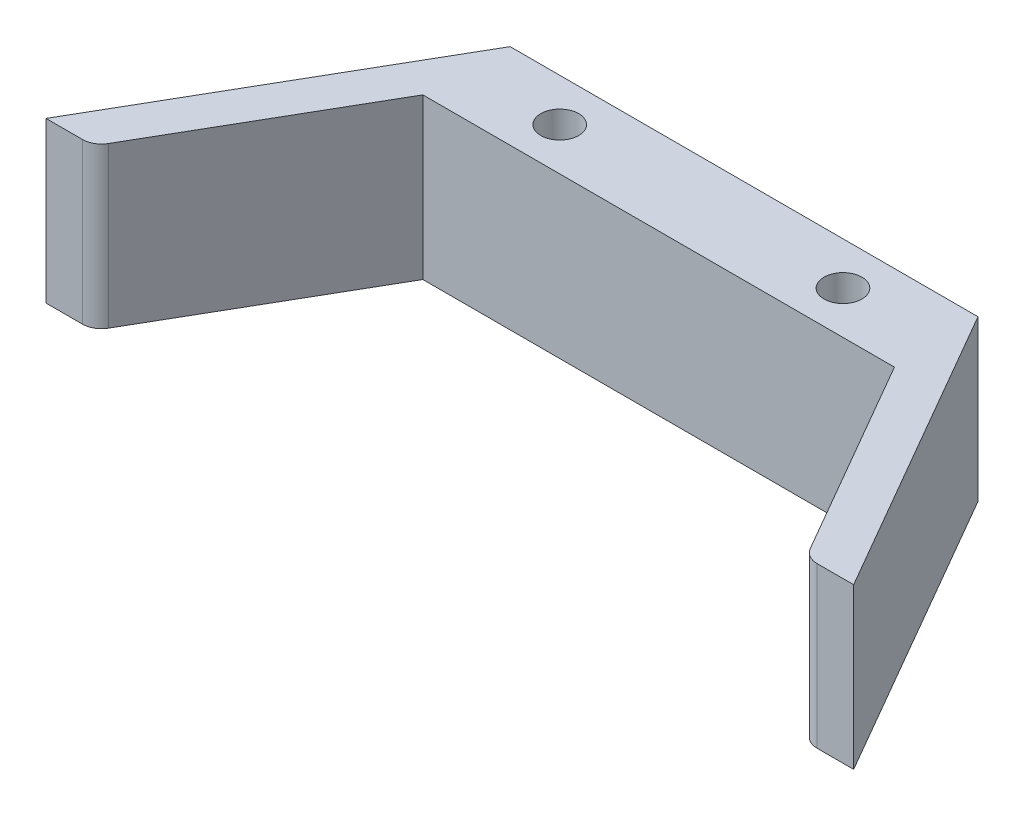
ISO-10303-21;
HEADER;
FILE_DESCRIPTION(('STEP AP214'),'2;1');
FILE_NAME('part.step','',(''),(''),'','','');
FILE_SCHEMA(('AUTOMOTIVE_DESIGN { 1 0 10303 214 1 1 1 1 }'));
ENDSEC;
DATA;
#1=APPLICATION_CONTEXT('core data for automotive mechanical design processes');
#2=APPLICATION_PROTOCOL_DEFINITION('international standard','automotive_design',2000,#1);
#3=PRODUCT_CONTEXT('',#1,'mechanical');
#4=PRODUCT('Part','Part','',(#3));
#5=PRODUCT_RELATED_PRODUCT_CATEGORY('part','',(#4));
#6=PRODUCT_DEFINITION_FORMATION('','',#4);
#7=PRODUCT_DEFINITION_CONTEXT('part definition',#1,'design');
#8=PRODUCT_DEFINITION('design','',#6,#7);
#9=PRODUCT_DEFINITION_SHAPE('','',#8);
#10=(LENGTH_UNIT() NAMED_UNIT(*) SI_UNIT(.MILLI.,.METRE.));
#11=(NAMED_UNIT(*) PLANE_ANGLE_UNIT() SI_UNIT($,.RADIAN.));
#12=(NAMED_UNIT(*) SI_UNIT($,.STERADIAN.) SOLID_ANGLE_UNIT());
#13=UNCERTAINTY_MEASURE_WITH_UNIT(LENGTH_MEASURE(1.E-05),#10,'distance_accuracy_value','');
#14=(GEOMETRIC_REPRESENTATION_CONTEXT(3) GLOBAL_UNCERTAINTY_ASSIGNED_CONTEXT((#13)) GLOBAL_UNIT_ASSIGNED_CONTEXT((#10,
#11,#12)) REPRESENTATION_CONTEXT('',''));
#15=CARTESIAN_POINT('',(0.,0.,0.));
#16=DIRECTION('',(0.,0.,1.));
#17=DIRECTION('',(1.,0.,0.));
#18=AXIS2_PLACEMENT_3D('',#15,#16,#17);
#19=CARTESIAN_POINT('',(0.,16.85,0.));
#20=DIRECTION('',(0.,0.,-1.));
#21=DIRECTION('',(-1.,0.,0.));
#22=AXIS2_PLACEMENT_3D('',#19,#20,#21);
#23=PLANE('',#22);
#24=DIRECTION('',(1.,0.,0.));
#25=VECTOR('',#24,1.);
#26=CARTESIAN_POINT('',(0.,0.,0.));
#27=LINE('',#26,#25);
#28=CARTESIAN_POINT('',(-24.8411524227069,0.,1.05016223731814E-12));
#29=VERTEX_POINT('',#28);
#30=CARTESIAN_POINT('',(24.8411524227069,0.,0.));
#31=VERTEX_POINT('',#30);
#32=EDGE_CURVE('E163',#29,#31,#27,.T.);
#33=ORIENTED_EDGE('',*,*,#32,.T.);
#34=DIRECTION('',(0.,-1.,0.));
#35=VECTOR('',#34,1.);
#36=CARTESIAN_POINT('',(24.8411524227069,16.85,0.));
#37=LINE('',#36,#35);
#38=CARTESIAN_POINT('',(24.8411524227069,16.85,0.));
#39=VERTEX_POINT('',#38);
#40=EDGE_CURVE('E11',#39,#31,#37,.T.);
#41=ORIENTED_EDGE('',*,*,#40,.F.);
#42=DIRECTION('',(1.,0.,0.));
#43=VECTOR('',#42,1.);
#44=CARTESIAN_POINT('',(0.,16.85,0.));
#45=LINE('',#44,#43);
#46=CARTESIAN_POINT('',(-24.8411524227069,16.85,1.05016223731814E-12));
#47=VERTEX_POINT('',#46);
#48=EDGE_CURVE('E102',#47,#39,#45,.T.);
#49=ORIENTED_EDGE('',*,*,#48,.F.);
#50=DIRECTION('',(0.,-1.,0.));
#51=VECTOR('',#50,1.);
#52=CARTESIAN_POINT('',(-24.8411524227069,16.85,1.05016223731814E-12));
#53=LINE('',#52,#51);
#54=EDGE_CURVE('E162',#47,#29,#53,.T.);
#55=ORIENTED_EDGE('',*,*,#54,.T.);
#56=EDGE_LOOP('',(#33,#41,#49,#55));
#57=FACE_BOUND('',#56,.T.);
#58=ADVANCED_FACE('F43',(#57),#23,.F.);
#59=CARTESIAN_POINT('',(18.6308643170516,16.85,-10.7565345286572));
#60=DIRECTION('',(-0.866025403785067,0.,0.499999999998913));
#61=DIRECTION('',(0.499999999998913,0.,0.866025403785067));
#62=AXIS2_PLACEMENT_3D('',#59,#60,#61);
#63=PLANE('',#62);
#64=DIRECTION('',(-0.499999999998913,0.,-0.866025403785067));
#65=VECTOR('',#64,1.);
#66=CARTESIAN_POINT('',(18.6308643170516,0.,-10.7565345286572));
#67=LINE('',#66,#65);
#68=CARTESIAN_POINT('',(36.9655080756526,0.,21.0000000000034));
#69=VERTEX_POINT('',#68);
#70=EDGE_CURVE('E167',#69,#31,#67,.T.);
#71=ORIENTED_EDGE('',*,*,#70,.F.);
#72=DIRECTION('',(0.,-1.,0.));
#73=VECTOR('',#72,1.);
#74=CARTESIAN_POINT('',(36.9655080756526,16.85,21.0000000000034));
#75=LINE('',#74,#73);
#76=CARTESIAN_POINT('',(36.9655080756526,16.85,21.0000000000034));
#77=VERTEX_POINT('',#76);
#78=EDGE_CURVE('E52',#77,#69,#75,.T.);
#79=ORIENTED_EDGE('',*,*,#78,.F.);
#80=DIRECTION('',(-0.499999999998913,0.,-0.866025403785067));
#81=VECTOR('',#80,1.);
#82=CARTESIAN_POINT('',(18.6308643170516,16.85,-10.7565345286572));
#83=LINE('',#82,#81);
#84=EDGE_CURVE('E239',#77,#39,#83,.T.);
#85=ORIENTED_EDGE('',*,*,#84,.T.);
#86=ORIENTED_EDGE('',*,*,#40,.T.);
#87=EDGE_LOOP('',(#71,#79,#85,#86));
#88=FACE_BOUND('',#87,.T.);
#89=ADVANCED_FACE('F238',(#88),#63,.T.);
#90=CARTESIAN_POINT('',(38.6975588832227,16.85,20.0000000000056));
#91=DIRECTION('',(0.,-1.,0.));
#92=DIRECTION('',(0.,0.,-1.));
#93=AXIS2_PLACEMENT_3D('',#90,#91,#92);
#94=CYLINDRICAL_SURFACE('',#93,2.);
#95=CARTESIAN_POINT('',(38.6975588832227,0.,20.0000000000056));
#96=DIRECTION('',(0.,1.,0.));
#97=DIRECTION('',(0.,0.,1.));
#98=AXIS2_PLACEMENT_3D('',#95,#96,#97);
#99=CIRCLE('',#98,2.);
#100=CARTESIAN_POINT('',(38.6975588832227,0.,22.0000000000056));
#101=VERTEX_POINT('',#100);
#102=EDGE_CURVE('E171',#69,#101,#99,.T.);
#103=ORIENTED_EDGE('',*,*,#102,.T.);
#104=DIRECTION('',(0.,-1.,0.));
#105=VECTOR('',#104,1.);
#106=CARTESIAN_POINT('',(38.6975588832227,16.85,22.0000000000056));
#107=LINE('',#106,#105);
#108=CARTESIAN_POINT('',(38.6975588832227,16.85,22.0000000000056));
#109=VERTEX_POINT('',#108);
#110=EDGE_CURVE('E220',#109,#101,#107,.T.);
#111=ORIENTED_EDGE('',*,*,#110,.F.);
#112=CARTESIAN_POINT('',(38.6975588832227,16.85,20.0000000000056));
#113=DIRECTION('',(0.,1.,0.));
#114=DIRECTION('',(0.,0.,1.));
#115=AXIS2_PLACEMENT_3D('',#112,#113,#114);
#116=CIRCLE('',#115,2.);
#117=EDGE_CURVE('E228',#77,#109,#116,.T.);
#118=ORIENTED_EDGE('',*,*,#117,.F.);
#119=ORIENTED_EDGE('',*,*,#78,.T.);
#120=EDGE_LOOP('',(#103,#111,#118,#119));
#121=FACE_BOUND('',#120,.T.);
#122=ADVANCED_FACE('F226',(#121),#94,.T.);
#123=CARTESIAN_POINT('',(-5.55111512312578E-12,16.85,22.));
#124=DIRECTION('',(0.,0.,1.));
#125=DIRECTION('',(1.,0.,0.));
#126=AXIS2_PLACEMENT_3D('',#123,#124,#125);
#127=PLANE('',#126);
#128=DIRECTION('',(-1.,0.,0.));
#129=VECTOR('',#128,1.);
#130=CARTESIAN_POINT('',(-5.55111512312578E-12,0.,22.));
#131=LINE('',#130,#129);
#132=CARTESIAN_POINT('',(42.5428583448418,0.,22.));
#133=VERTEX_POINT('',#132);
#134=EDGE_CURVE('E175',#133,#101,#131,.T.);
#135=ORIENTED_EDGE('',*,*,#134,.F.);
#136=DIRECTION('',(0.,-1.,0.));
#137=VECTOR('',#136,1.);
#138=CARTESIAN_POINT('',(42.5428583448418,16.85,22.));
#139=LINE('',#138,#137);
#140=CARTESIAN_POINT('',(42.5428583448418,16.85,22.));
#141=VERTEX_POINT('',#140);
#142=EDGE_CURVE('E217',#141,#133,#139,.T.);
#143=ORIENTED_EDGE('',*,*,#142,.F.);
#144=DIRECTION('',(-1.,0.,0.));
#145=VECTOR('',#144,1.);
#146=CARTESIAN_POINT('',(-5.55111512312578E-12,16.85,22.));
#147=LINE('',#146,#145);
#148=EDGE_CURVE('E259',#141,#109,#147,.T.);
#149=ORIENTED_EDGE('',*,*,#148,.T.);
#150=ORIENTED_EDGE('',*,*,#110,.T.);
#151=EDGE_LOOP('',(#135,#143,#149,#150));
#152=FACE_BOUND('',#151,.T.);
#153=ADVANCED_FACE('F257',(#152),#127,.T.);
#154=CARTESIAN_POINT('',(22.3808643170272,16.85,-12.9215980381305));
#155=DIRECTION('',(-0.866025403784444,0.,0.499999999999991));
#156=DIRECTION('',(0.499999999999991,0.,0.866025403784444));
#157=AXIS2_PLACEMENT_3D('',#154,#155,#156);
#158=PLANE('',#157);
#159=DIRECTION('',(-0.499999999999991,0.,-0.866025403784444));
#160=VECTOR('',#159,1.);
#161=CARTESIAN_POINT('',(22.3808643170272,0.,-12.9215980381305));
#162=LINE('',#161,#160);
#163=CARTESIAN_POINT('',(24.6449999999972,0.,-8.99999999999679));
#164=VERTEX_POINT('',#163);
#165=EDGE_CURVE('E179',#133,#164,#162,.T.);
#166=ORIENTED_EDGE('',*,*,#165,.T.);
#167=DIRECTION('',(0.,-1.,0.));
#168=VECTOR('',#167,1.);
#169=CARTESIAN_POINT('',(24.6449999999972,16.85,-8.99999999999679));
#170=LINE('',#169,#168);
#171=CARTESIAN_POINT('',(24.6449999999972,16.85,-8.99999999999679));
#172=VERTEX_POINT('',#171);
#173=EDGE_CURVE('E213',#172,#164,#170,.T.);
#174=ORIENTED_EDGE('',*,*,#173,.F.);
#175=DIRECTION('',(-0.499999999999991,0.,-0.866025403784444));
#176=VECTOR('',#175,1.);
#177=CARTESIAN_POINT('',(22.3808643170272,16.85,-12.9215980381305));
#178=LINE('',#177,#176);
#179=EDGE_CURVE('E254',#141,#172,#178,.T.);
#180=ORIENTED_EDGE('',*,*,#179,.F.);
#181=ORIENTED_EDGE('',*,*,#142,.T.);
#182=EDGE_LOOP('',(#166,#174,#180,#181));
#183=FACE_BOUND('',#182,.T.);
#184=ADVANCED_FACE('F253',(#183),#158,.F.);
#185=CARTESIAN_POINT('',(-2.41473507855972E-12,16.85,-8.99999999999986));
#186=DIRECTION('',(0.,0.,1.));
#187=DIRECTION('',(1.,0.,0.));
#188=AXIS2_PLACEMENT_3D('',#185,#186,#187);
#189=PLANE('',#188);
#190=DIRECTION('',(-1.,0.,0.));
#191=VECTOR('',#190,1.);
#192=CARTESIAN_POINT('',(-2.41473507855972E-12,0.,-8.99999999999986));
#193=LINE('',#192,#191);
#194=CARTESIAN_POINT('',(-24.6450000000022,0.,-8.99999999999986));
#195=VERTEX_POINT('',#194);
#196=EDGE_CURVE('E182',#164,#195,#193,.T.);
#197=ORIENTED_EDGE('',*,*,#196,.T.);
#198=DIRECTION('',(0.,-1.,0.));
#199=VECTOR('',#198,1.);
#200=CARTESIAN_POINT('',(-24.6450000000022,16.85,-8.99999999999986));
#201=LINE('',#200,#199);
#202=CARTESIAN_POINT('',(-24.6450000000022,16.85,-8.99999999999986));
#203=VERTEX_POINT('',#202);
#204=EDGE_CURVE('E209',#203,#195,#201,.T.);
#205=ORIENTED_EDGE('',*,*,#204,.F.);
#206=DIRECTION('',(-1.,0.,0.));
#207=VECTOR('',#206,1.);
#208=CARTESIAN_POINT('',(-2.41473507855972E-12,16.85,-8.99999999999986));
#209=LINE('',#208,#207);
#210=EDGE_CURVE('E249',#172,#203,#209,.T.);
#211=ORIENTED_EDGE('',*,*,#210,.F.);
#212=ORIENTED_EDGE('',*,*,#173,.T.);
#213=EDGE_LOOP('',(#197,#205,#211,#212));
#214=FACE_BOUND('',#213,.T.);
#215=ADVANCED_FACE('F248',(#214),#189,.F.);
#216=CARTESIAN_POINT('',(-22.3808643170321,16.85,-12.9215980381337));
#217=DIRECTION('',(0.866025403784436,0.,0.500000000000004));
#218=DIRECTION('',(0.500000000000004,0.,-0.866025403784436));
#219=AXIS2_PLACEMENT_3D('',#216,#217,#218);
#220=PLANE('',#219);
#221=DIRECTION('',(-0.500000000000004,0.,0.866025403784436));
#222=VECTOR('',#221,1.);
#223=CARTESIAN_POINT('',(-22.3808643170321,0.,-12.9215980381337));
#224=LINE('',#223,#222);
#225=CARTESIAN_POINT('',(-42.5428583448418,0.,22.));
#226=VERTEX_POINT('',#225);
#227=EDGE_CURVE('E185',#195,#226,#224,.T.);
#228=ORIENTED_EDGE('',*,*,#227,.T.);
#229=DIRECTION('',(0.,-1.,0.));
#230=VECTOR('',#229,1.);
#231=CARTESIAN_POINT('',(-42.5428583448418,16.85,22.));
#232=LINE('',#231,#230);
#233=CARTESIAN_POINT('',(-42.5428583448418,16.85,22.));
#234=VERTEX_POINT('',#233);
#235=EDGE_CURVE('E145',#234,#226,#232,.T.);
#236=ORIENTED_EDGE('',*,*,#235,.F.);
#237=DIRECTION('',(-0.500000000000004,0.,0.866025403784436));
#238=VECTOR('',#237,1.);
#239=CARTESIAN_POINT('',(-22.3808643170321,16.85,-12.9215980381337));
#240=LINE('',#239,#238);
#241=EDGE_CURVE('E130',#203,#234,#240,.T.);
#242=ORIENTED_EDGE('',*,*,#241,.F.);
#243=ORIENTED_EDGE('',*,*,#204,.T.);
#244=EDGE_LOOP('',(#228,#236,#242,#243));
#245=FACE_BOUND('',#244,.T.);
#246=ADVANCED_FACE('F244',(#245),#220,.F.);
#247=CARTESIAN_POINT('',(-1.84574577843932E-12,16.85,22.));
#248=DIRECTION('',(0.,0.,-1.));
#249=DIRECTION('',(-1.,0.,0.));
#250=AXIS2_PLACEMENT_3D('',#247,#248,#249);
#251=PLANE('',#250);
#252=DIRECTION('',(1.,0.,0.));
#253=VECTOR('',#252,1.);
#254=CARTESIAN_POINT('',(-1.84574577843932E-12,0.,22.));
#255=LINE('',#254,#253);
#256=CARTESIAN_POINT('',(-38.6975588832227,0.,22.));
#257=VERTEX_POINT('',#256);
#258=EDGE_CURVE('E140',#226,#257,#255,.T.);
#259=ORIENTED_EDGE('',*,*,#258,.T.);
#260=DIRECTION('',(0.,-1.,0.));
#261=VECTOR('',#260,1.);
#262=CARTESIAN_POINT('',(-38.6975588832227,16.85,22.));
#263=LINE('',#262,#261);
#264=CARTESIAN_POINT('',(-38.6975588832227,16.85,22.));
#265=VERTEX_POINT('',#264);
#266=EDGE_CURVE('E137',#265,#257,#263,.T.);
#267=ORIENTED_EDGE('',*,*,#266,.F.);
#268=DIRECTION('',(1.,0.,0.));
#269=VECTOR('',#268,1.);
#270=CARTESIAN_POINT('',(-1.84574577843932E-12,16.85,22.));
#271=LINE('',#270,#269);
#272=EDGE_CURVE('E123',#234,#265,#271,.T.);
#273=ORIENTED_EDGE('',*,*,#272,.F.);
#274=ORIENTED_EDGE('',*,*,#235,.T.);
#275=EDGE_LOOP('',(#259,#267,#273,#274));
#276=FACE_BOUND('',#275,.T.);
#277=ADVANCED_FACE('F138',(#276),#251,.F.);
#278=CARTESIAN_POINT('',(-38.6975588832227,16.85,20.));
#279=DIRECTION('',(0.,-1.,0.));
#280=DIRECTION('',(0.,0.,-1.));
#281=AXIS2_PLACEMENT_3D('',#278,#279,#280);
#282=CYLINDRICAL_SURFACE('',#281,2.);
#283=CARTESIAN_POINT('',(-38.6975588832227,0.,20.));
#284=DIRECTION('',(0.,1.,0.));
#285=DIRECTION('',(0.,0.,1.));
#286=AXIS2_PLACEMENT_3D('',#283,#284,#285);
#287=CIRCLE('',#286,2.);
#288=CARTESIAN_POINT('',(-36.9655080756526,0.,20.9999999999978));
#289=VERTEX_POINT('',#288);
#290=EDGE_CURVE('E190',#289,#257,#287,.F.);
#291=ORIENTED_EDGE('',*,*,#290,.F.);
#292=DIRECTION('',(0.,-1.,0.));
#293=VECTOR('',#292,1.);
#294=CARTESIAN_POINT('',(-36.9655080756526,16.85,20.9999999999978));
#295=LINE('',#294,#293);
#296=CARTESIAN_POINT('',(-36.9655080756526,16.85,20.9999999999978));
#297=VERTEX_POINT('',#296);
#298=EDGE_CURVE('E93',#297,#289,#295,.T.);
#299=ORIENTED_EDGE('',*,*,#298,.F.);
#300=CARTESIAN_POINT('',(-38.6975588832227,16.85,20.));
#301=DIRECTION('',(0.,1.,0.));
#302=DIRECTION('',(0.,0.,1.));
#303=AXIS2_PLACEMENT_3D('',#300,#301,#302);
#304=CIRCLE('',#303,2.);
#305=EDGE_CURVE('E128',#297,#265,#304,.F.);
#306=ORIENTED_EDGE('',*,*,#305,.T.);
#307=ORIENTED_EDGE('',*,*,#266,.T.);
#308=EDGE_LOOP('',(#291,#299,#306,#307));
#309=FACE_BOUND('',#308,.T.);
#310=ADVANCED_FACE('F147',(#309),#282,.T.);
#311=CARTESIAN_POINT('',(-14.9200000000024,16.85,-4.49999999999759));
#312=DIRECTION('',(0.,-1.,0.));
#313=DIRECTION('',(0.,0.,-1.));
#314=AXIS2_PLACEMENT_3D('',#311,#312,#313);
#315=CYLINDRICAL_SURFACE('',#314,2.);
#316=CARTESIAN_POINT('',(-14.9200000000024,16.85,-4.49999999999759));
#317=DIRECTION('',(0.,1.,0.));
#318=DIRECTION('',(0.,0.,1.));
#319=AXIS2_PLACEMENT_3D('',#316,#317,#318);
#320=CIRCLE('',#319,2.);
#321=CARTESIAN_POINT('',(-14.9200000000024,16.85,-2.49999999999759));
#322=VERTEX_POINT('',#321);
#323=EDGE_CURVE('E151',#322,#322,#320,.T.);
#324=ORIENTED_EDGE('',*,*,#323,.T.);
#325=EDGE_LOOP('',(#324));
#326=FACE_BOUND('',#325,.T.);
#327=CARTESIAN_POINT('',(-14.9200000000024,0.,-4.49999999999759));
#328=DIRECTION('',(0.,1.,0.));
#329=DIRECTION('',(0.,0.,1.));
#330=AXIS2_PLACEMENT_3D('',#327,#328,#329);
#331=CIRCLE('',#330,2.);
#332=CARTESIAN_POINT('',(-14.9200000000024,0.,-2.49999999999759));
#333=VERTEX_POINT('',#332);
#334=EDGE_CURVE('E195',#333,#333,#331,.T.);
#335=ORIENTED_EDGE('',*,*,#334,.F.);
#336=EDGE_LOOP('',(#335));
#337=FACE_BOUND('',#336,.T.);
#338=ADVANCED_FACE('F341',(#326,#337),#315,.F.);
#339=CARTESIAN_POINT('',(-18.6308643170589,16.85,-10.7565345286553));
#340=DIRECTION('',(-0.866025403785066,0.,-0.499999999998914));
#341=DIRECTION('',(-0.499999999998914,0.,0.866025403785066));
#342=AXIS2_PLACEMENT_3D('',#339,#340,#341);
#343=PLANE('',#342);
#344=DIRECTION('',(0.499999999998914,0.,-0.866025403785066));
#345=VECTOR('',#344,1.);
#346=CARTESIAN_POINT('',(-18.6308643170589,0.,-10.7565345286553));
#347=LINE('',#346,#345);
#348=EDGE_CURVE('E96',#289,#29,#347,.T.);
#349=ORIENTED_EDGE('',*,*,#348,.T.);
#350=ORIENTED_EDGE('',*,*,#54,.F.);
#351=DIRECTION('',(0.499999999998914,0.,-0.866025403785066));
#352=VECTOR('',#351,1.);
#353=CARTESIAN_POINT('',(-18.6308643170589,16.85,-10.7565345286553));
#354=LINE('',#353,#352);
#355=EDGE_CURVE('E60',#297,#47,#354,.T.);
#356=ORIENTED_EDGE('',*,*,#355,.F.);
#357=ORIENTED_EDGE('',*,*,#298,.T.);
#358=EDGE_LOOP('',(#349,#350,#356,#357));
#359=FACE_BOUND('',#358,.T.);
#360=ADVANCED_FACE('F351',(#359),#343,.F.);
#361=CARTESIAN_POINT('',(14.9199999999969,16.85,-4.5));
#362=DIRECTION('',(0.,-1.,0.));
#363=DIRECTION('',(0.,0.,-1.));
#364=AXIS2_PLACEMENT_3D('',#361,#362,#363);
#365=CYLINDRICAL_SURFACE('',#364,2.);
#366=CARTESIAN_POINT('',(14.9199999999969,16.85,-4.5));
#367=DIRECTION('',(0.,1.,0.));
#368=DIRECTION('',(0.,0.,1.));
#369=AXIS2_PLACEMENT_3D('',#366,#367,#368);
#370=CIRCLE('',#369,2.);
#371=CARTESIAN_POINT('',(14.9199999999969,16.85,-2.5));
#372=VERTEX_POINT('',#371);
#373=EDGE_CURVE('E158',#372,#372,#370,.F.);
#374=ORIENTED_EDGE('',*,*,#373,.F.);
#375=EDGE_LOOP('',(#374));
#376=FACE_BOUND('',#375,.T.);
#377=CARTESIAN_POINT('',(14.9199999999969,0.,-4.5));
#378=DIRECTION('',(0.,1.,0.));
#379=DIRECTION('',(0.,0.,1.));
#380=AXIS2_PLACEMENT_3D('',#377,#378,#379);
#381=CIRCLE('',#380,2.);
#382=CARTESIAN_POINT('',(14.9199999999969,0.,-2.5));
#383=VERTEX_POINT('',#382);
#384=EDGE_CURVE('E199',#383,#383,#381,.F.);
#385=ORIENTED_EDGE('',*,*,#384,.T.);
#386=EDGE_LOOP('',(#385));
#387=FACE_BOUND('',#386,.T.);
#388=ADVANCED_FACE('F362',(#376,#387),#365,.F.);
#389=CARTESIAN_POINT('',(0.,16.85,0.));
#390=DIRECTION('',(0.,1.,0.));
#391=DIRECTION('',(0.,0.,1.));
#392=AXIS2_PLACEMENT_3D('',#389,#390,#391);
#393=PLANE('',#392);
#394=ORIENTED_EDGE('',*,*,#48,.T.);
#395=ORIENTED_EDGE('',*,*,#84,.F.);
#396=ORIENTED_EDGE('',*,*,#117,.T.);
#397=ORIENTED_EDGE('',*,*,#148,.F.);
#398=ORIENTED_EDGE('',*,*,#179,.T.);
#399=ORIENTED_EDGE('',*,*,#210,.T.);
#400=ORIENTED_EDGE('',*,*,#241,.T.);
#401=ORIENTED_EDGE('',*,*,#272,.T.);
#402=ORIENTED_EDGE('',*,*,#305,.F.);
#403=ORIENTED_EDGE('',*,*,#355,.T.);
#404=EDGE_LOOP('',(#394,#395,#396,#397,#398,#399,#400,#401,#402,#403));
#405=FACE_BOUND('',#404,.T.);
#406=ORIENTED_EDGE('',*,*,#323,.F.);
#407=EDGE_LOOP('',(#406));
#408=FACE_BOUND('',#407,.T.);
#409=ORIENTED_EDGE('',*,*,#373,.T.);
#410=EDGE_LOOP('',(#409));
#411=FACE_BOUND('',#410,.T.);
#412=ADVANCED_FACE('F125',(#405,#408,#411),#393,.T.);
#413=CARTESIAN_POINT('',(0.,0.,0.));
#414=DIRECTION('',(0.,1.,0.));
#415=DIRECTION('',(0.,0.,1.));
#416=AXIS2_PLACEMENT_3D('',#413,#414,#415);
#417=PLANE('',#416);
#418=ORIENTED_EDGE('',*,*,#32,.F.);
#419=ORIENTED_EDGE('',*,*,#348,.F.);
#420=ORIENTED_EDGE('',*,*,#290,.T.);
#421=ORIENTED_EDGE('',*,*,#258,.F.);
#422=ORIENTED_EDGE('',*,*,#227,.F.);
#423=ORIENTED_EDGE('',*,*,#196,.F.);
#424=ORIENTED_EDGE('',*,*,#165,.F.);
#425=ORIENTED_EDGE('',*,*,#134,.T.);
#426=ORIENTED_EDGE('',*,*,#102,.F.);
#427=ORIENTED_EDGE('',*,*,#70,.T.);
#428=EDGE_LOOP('',(#418,#419,#420,#421,#422,#423,#424,#425,#426,#427));
#429=FACE_BOUND('',#428,.T.);
#430=ORIENTED_EDGE('',*,*,#334,.T.);
#431=EDGE_LOOP('',(#430));
#432=FACE_BOUND('',#431,.T.);
#433=ORIENTED_EDGE('',*,*,#384,.F.);
#434=EDGE_LOOP('',(#433));
#435=FACE_BOUND('',#434,.T.);
#436=ADVANCED_FACE('F234',(#429,#432,#435),#417,.F.);
#437=CLOSED_SHELL('',(#58,#89,#122,#153,#184,#215,#246,#277,#310,#338,#360,#388,#412,#436));
#438=MANIFOLD_SOLID_BREP('B2',#437);
#439=ADVANCED_BREP_SHAPE_REPRESENTATION('',(#18,#438),#14);
#440=SHAPE_DEFINITION_REPRESENTATION(#9,#439);
ENDSEC;
END-ISO-10303-21;
